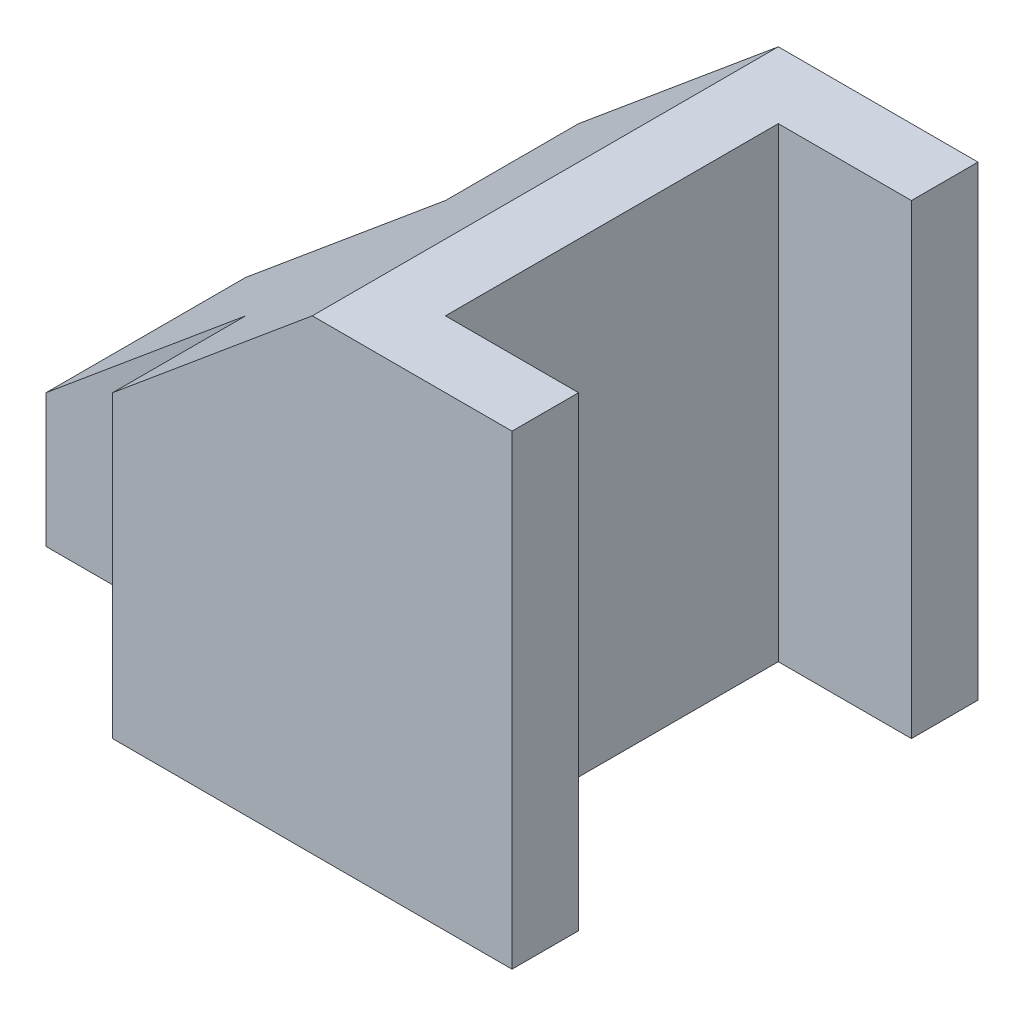
ISO-10303-21;
HEADER;
FILE_DESCRIPTION(('STEP AP214'),'2;1');
FILE_NAME('part.step','',(''),(''),'','','');
FILE_SCHEMA(('AUTOMOTIVE_DESIGN { 1 0 10303 214 1 1 1 1 }'));
ENDSEC;
DATA;
#1=APPLICATION_CONTEXT('core data for automotive mechanical design processes');
#2=APPLICATION_PROTOCOL_DEFINITION('international standard','automotive_design',2000,#1);
#3=PRODUCT_CONTEXT('',#1,'mechanical');
#4=PRODUCT('Part','Part','',(#3));
#5=PRODUCT_RELATED_PRODUCT_CATEGORY('part','',(#4));
#6=PRODUCT_DEFINITION_FORMATION('','',#4);
#7=PRODUCT_DEFINITION_CONTEXT('part definition',#1,'design');
#8=PRODUCT_DEFINITION('design','',#6,#7);
#9=PRODUCT_DEFINITION_SHAPE('','',#8);
#10=(LENGTH_UNIT() NAMED_UNIT(*) SI_UNIT(.MILLI.,.METRE.));
#11=(NAMED_UNIT(*) PLANE_ANGLE_UNIT() SI_UNIT($,.RADIAN.));
#12=(NAMED_UNIT(*) SI_UNIT($,.STERADIAN.) SOLID_ANGLE_UNIT());
#13=UNCERTAINTY_MEASURE_WITH_UNIT(LENGTH_MEASURE(1.E-05),#10,'distance_accuracy_value','');
#14=(GEOMETRIC_REPRESENTATION_CONTEXT(3) GLOBAL_UNCERTAINTY_ASSIGNED_CONTEXT((#13)) GLOBAL_UNIT_ASSIGNED_CONTEXT((#10,
#11,#12)) REPRESENTATION_CONTEXT('',''));
#15=CARTESIAN_POINT('',(0.,0.,0.));
#16=DIRECTION('',(0.,0.,1.));
#17=DIRECTION('',(1.,0.,0.));
#18=AXIS2_PLACEMENT_3D('',#15,#16,#17);
#19=CARTESIAN_POINT('',(0.,10000.,-35000.));
#20=DIRECTION('',(-1.,0.,0.));
#21=DIRECTION('',(0.,0.,1.));
#22=AXIS2_PLACEMENT_3D('',#19,#20,#21);
#23=PLANE('',#22);
#24=DIRECTION('',(0.,1.,0.));
#25=VECTOR('',#24,1.);
#26=CARTESIAN_POINT('',(0.,0.,-25000.));
#27=LINE('',#26,#25);
#28=CARTESIAN_POINT('',(0.,0.,-25000.));
#29=VERTEX_POINT('',#28);
#30=CARTESIAN_POINT('',(0.,10000.,-25000.));
#31=VERTEX_POINT('',#30);
#32=EDGE_CURVE('E127',#29,#31,#27,.T.);
#33=ORIENTED_EDGE('',*,*,#32,.F.);
#34=DIRECTION('',(0.,0.,1.));
#35=VECTOR('',#34,1.);
#36=CARTESIAN_POINT('',(0.,0.,-35000.));
#37=LINE('',#36,#35);
#38=CARTESIAN_POINT('',(0.,0.,-10000.));
#39=VERTEX_POINT('',#38);
#40=EDGE_CURVE('E35',#29,#39,#37,.T.);
#41=ORIENTED_EDGE('',*,*,#40,.T.);
#42=DIRECTION('',(0.,-1.,0.));
#43=VECTOR('',#42,1.);
#44=CARTESIAN_POINT('',(0.,10000.,-10000.));
#45=LINE('',#44,#43);
#46=CARTESIAN_POINT('',(0.,10000.,-10000.));
#47=VERTEX_POINT('',#46);
#48=EDGE_CURVE('E148',#47,#39,#45,.T.);
#49=ORIENTED_EDGE('',*,*,#48,.F.);
#50=DIRECTION('',(0.,0.,1.));
#51=VECTOR('',#50,1.);
#52=CARTESIAN_POINT('',(0.,10000.,-35000.));
#53=LINE('',#52,#51);
#54=EDGE_CURVE('E11',#31,#47,#53,.T.);
#55=ORIENTED_EDGE('',*,*,#54,.F.);
#56=EDGE_LOOP('',(#33,#41,#49,#55));
#57=FACE_BOUND('',#56,.T.);
#58=ADVANCED_FACE('F32',(#57),#23,.T.);
#59=CARTESIAN_POINT('',(45000.,0.,-35000.));
#60=DIRECTION('',(1.,0.,0.));
#61=DIRECTION('',(0.,0.,-1.));
#62=AXIS2_PLACEMENT_3D('',#59,#60,#61);
#63=PLANE('',#62);
#64=DIRECTION('',(0.,1.,0.));
#65=VECTOR('',#64,1.);
#66=CARTESIAN_POINT('',(45000.,0.,-5000.));
#67=LINE('',#66,#65);
#68=CARTESIAN_POINT('',(45000.,0.,-5000.));
#69=VERTEX_POINT('',#68);
#70=CARTESIAN_POINT('',(45000.,35000.,-5000.));
#71=VERTEX_POINT('',#70);
#72=EDGE_CURVE('E188',#69,#71,#67,.T.);
#73=ORIENTED_EDGE('',*,*,#72,.T.);
#74=DIRECTION('',(0.,0.,1.));
#75=VECTOR('',#74,1.);
#76=CARTESIAN_POINT('',(45000.,35000.,-35000.));
#77=LINE('',#76,#75);
#78=CARTESIAN_POINT('',(45000.,35000.,0.));
#79=VERTEX_POINT('',#78);
#80=EDGE_CURVE('E220',#71,#79,#77,.T.);
#81=ORIENTED_EDGE('',*,*,#80,.T.);
#82=DIRECTION('',(0.,1.,0.));
#83=VECTOR('',#82,1.);
#84=CARTESIAN_POINT('',(45000.,0.,0.));
#85=LINE('',#84,#83);
#86=CARTESIAN_POINT('',(45000.,0.,0.));
#87=VERTEX_POINT('',#86);
#88=EDGE_CURVE('E209',#87,#79,#85,.T.);
#89=ORIENTED_EDGE('',*,*,#88,.F.);
#90=DIRECTION('',(0.,0.,1.));
#91=VECTOR('',#90,1.);
#92=CARTESIAN_POINT('',(45000.,0.,-35000.));
#93=LINE('',#92,#91);
#94=EDGE_CURVE('E223',#69,#87,#93,.T.);
#95=ORIENTED_EDGE('',*,*,#94,.F.);
#96=EDGE_LOOP('',(#73,#81,#89,#95));
#97=FACE_BOUND('',#96,.T.);
#98=ADVANCED_FACE('F234',(#97),#63,.T.);
#99=CARTESIAN_POINT('',(30000.,35000.,-35000.));
#100=DIRECTION('',(-0.64018439966448,0.768221279597376,0.));
#101=DIRECTION('',(-0.768221279597376,-0.64018439966448,0.));
#102=AXIS2_PLACEMENT_3D('',#99,#100,#101);
#103=PLANE('',#102);
#104=DIRECTION('',(0.,0.,-1.));
#105=VECTOR('',#104,1.);
#106=CARTESIAN_POINT('',(15000.,22500.,-25000.));
#107=LINE('',#106,#105);
#108=CARTESIAN_POINT('',(15000.,22500.,-25000.));
#109=VERTEX_POINT('',#108);
#110=CARTESIAN_POINT('',(15000.,22500.,-35000.));
#111=VERTEX_POINT('',#110);
#112=EDGE_CURVE('E48',#109,#111,#107,.T.);
#113=ORIENTED_EDGE('',*,*,#112,.F.);
#114=DIRECTION('',(0.768221279597376,0.64018439966448,0.));
#115=VECTOR('',#114,1.);
#116=CARTESIAN_POINT('',(0.,10000.,-25000.));
#117=LINE('',#116,#115);
#118=EDGE_CURVE('E131',#31,#109,#117,.T.);
#119=ORIENTED_EDGE('',*,*,#118,.F.);
#120=ORIENTED_EDGE('',*,*,#54,.T.);
#121=DIRECTION('',(-0.768221279597376,-0.64018439966448,0.));
#122=VECTOR('',#121,1.);
#123=CARTESIAN_POINT('',(15000.,22500.,-10000.));
#124=LINE('',#123,#122);
#125=CARTESIAN_POINT('',(15000.,22500.,-10000.));
#126=VERTEX_POINT('',#125);
#127=EDGE_CURVE('E164',#126,#47,#124,.T.);
#128=ORIENTED_EDGE('',*,*,#127,.F.);
#129=DIRECTION('',(0.,0.,1.));
#130=VECTOR('',#129,1.);
#131=CARTESIAN_POINT('',(15000.,22500.,-10000.));
#132=LINE('',#131,#130);
#133=CARTESIAN_POINT('',(15000.,22500.,0.));
#134=VERTEX_POINT('',#133);
#135=EDGE_CURVE('E166',#126,#134,#132,.T.);
#136=ORIENTED_EDGE('',*,*,#135,.T.);
#137=DIRECTION('',(-0.768221279597376,-0.64018439966448,0.));
#138=VECTOR('',#137,1.);
#139=CARTESIAN_POINT('',(30000.,35000.,0.));
#140=LINE('',#139,#138);
#141=CARTESIAN_POINT('',(30000.,35000.,0.));
#142=VERTEX_POINT('',#141);
#143=EDGE_CURVE('E200',#142,#134,#140,.T.);
#144=ORIENTED_EDGE('',*,*,#143,.F.);
#145=DIRECTION('',(0.,0.,1.));
#146=VECTOR('',#145,1.);
#147=CARTESIAN_POINT('',(30000.,35000.,-35000.));
#148=LINE('',#147,#146);
#149=CARTESIAN_POINT('',(30000.,35000.,-35000.));
#150=VERTEX_POINT('',#149);
#151=EDGE_CURVE('E40',#150,#142,#148,.T.);
#152=ORIENTED_EDGE('',*,*,#151,.F.);
#153=DIRECTION('',(-0.768221279597376,-0.64018439966448,0.));
#154=VECTOR('',#153,1.);
#155=CARTESIAN_POINT('',(30000.,35000.,-35000.));
#156=LINE('',#155,#154);
#157=EDGE_CURVE('E206',#150,#111,#156,.T.);
#158=ORIENTED_EDGE('',*,*,#157,.T.);
#159=EDGE_LOOP('',(#113,#119,#120,#128,#136,#144,#152,#158));
#160=FACE_BOUND('',#159,.T.);
#161=ADVANCED_FACE('F140',(#160),#103,.T.);
#162=CARTESIAN_POINT('',(45000.,35000.,-35000.));
#163=DIRECTION('',(0.,1.,0.));
#164=DIRECTION('',(0.,0.,1.));
#165=AXIS2_PLACEMENT_3D('',#162,#163,#164);
#166=PLANE('',#165);
#167=DIRECTION('',(1.,0.,0.));
#168=VECTOR('',#167,1.);
#169=CARTESIAN_POINT('',(45000.,35000.,-5000.));
#170=LINE('',#169,#168);
#171=CARTESIAN_POINT('',(35000.,35000.,-5000.));
#172=VERTEX_POINT('',#171);
#173=EDGE_CURVE('E175',#172,#71,#170,.T.);
#174=ORIENTED_EDGE('',*,*,#173,.F.);
#175=DIRECTION('',(0.,0.,1.));
#176=VECTOR('',#175,1.);
#177=CARTESIAN_POINT('',(35000.,35000.,-30000.));
#178=LINE('',#177,#176);
#179=CARTESIAN_POINT('',(35000.,35000.,-30000.));
#180=VERTEX_POINT('',#179);
#181=EDGE_CURVE('E184',#180,#172,#178,.T.);
#182=ORIENTED_EDGE('',*,*,#181,.F.);
#183=DIRECTION('',(-1.,0.,0.));
#184=VECTOR('',#183,1.);
#185=CARTESIAN_POINT('',(45000.,35000.,-30000.));
#186=LINE('',#185,#184);
#187=CARTESIAN_POINT('',(45000.,35000.,-30000.));
#188=VERTEX_POINT('',#187);
#189=EDGE_CURVE('E169',#188,#180,#186,.T.);
#190=ORIENTED_EDGE('',*,*,#189,.F.);
#191=CARTESIAN_POINT('',(45000.,35000.,-35000.));
#192=VERTEX_POINT('',#191);
#193=EDGE_CURVE('E218',#192,#188,#77,.T.);
#194=ORIENTED_EDGE('',*,*,#193,.F.);
#195=DIRECTION('',(-1.,0.,0.));
#196=VECTOR('',#195,1.);
#197=CARTESIAN_POINT('',(45000.,35000.,-35000.));
#198=LINE('',#197,#196);
#199=EDGE_CURVE('E203',#192,#150,#198,.T.);
#200=ORIENTED_EDGE('',*,*,#199,.T.);
#201=ORIENTED_EDGE('',*,*,#151,.T.);
#202=DIRECTION('',(-1.,0.,0.));
#203=VECTOR('',#202,1.);
#204=CARTESIAN_POINT('',(45000.,35000.,0.));
#205=LINE('',#204,#203);
#206=EDGE_CURVE('E212',#79,#142,#205,.T.);
#207=ORIENTED_EDGE('',*,*,#206,.F.);
#208=ORIENTED_EDGE('',*,*,#80,.F.);
#209=EDGE_LOOP('',(#174,#182,#190,#194,#200,#201,#207,#208));
#210=FACE_BOUND('',#209,.T.);
#211=ADVANCED_FACE('F254',(#210),#166,.T.);
#212=DIRECTION('',(0.,1.,0.));
#213=VECTOR('',#212,1.);
#214=CARTESIAN_POINT('',(45000.,0.,-30000.));
#215=LINE('',#214,#213);
#216=CARTESIAN_POINT('',(45000.,0.,-30000.));
#217=VERTEX_POINT('',#216);
#218=EDGE_CURVE('E181',#217,#188,#215,.T.);
#219=ORIENTED_EDGE('',*,*,#218,.F.);
#220=CARTESIAN_POINT('',(45000.,0.,-35000.));
#221=VERTEX_POINT('',#220);
#222=EDGE_CURVE('E221',#221,#217,#93,.T.);
#223=ORIENTED_EDGE('',*,*,#222,.F.);
#224=DIRECTION('',(0.,1.,0.));
#225=VECTOR('',#224,1.);
#226=CARTESIAN_POINT('',(45000.,0.,-35000.));
#227=LINE('',#226,#225);
#228=EDGE_CURVE('E199',#221,#192,#227,.T.);
#229=ORIENTED_EDGE('',*,*,#228,.T.);
#230=ORIENTED_EDGE('',*,*,#193,.T.);
#231=EDGE_LOOP('',(#219,#223,#229,#230));
#232=FACE_BOUND('',#231,.T.);
#233=ADVANCED_FACE('F258',(#232),#63,.T.);
#234=CARTESIAN_POINT('',(0.,0.,-35000.));
#235=DIRECTION('',(0.,-1.,0.));
#236=DIRECTION('',(0.,0.,-1.));
#237=AXIS2_PLACEMENT_3D('',#234,#235,#236);
#238=PLANE('',#237);
#239=DIRECTION('',(0.,0.,-1.));
#240=VECTOR('',#239,1.);
#241=CARTESIAN_POINT('',(15000.,0.,-25000.));
#242=LINE('',#241,#240);
#243=CARTESIAN_POINT('',(15000.,0.,-25000.));
#244=VERTEX_POINT('',#243);
#245=CARTESIAN_POINT('',(15000.,0.,-35000.));
#246=VERTEX_POINT('',#245);
#247=EDGE_CURVE('E157',#244,#246,#242,.T.);
#248=ORIENTED_EDGE('',*,*,#247,.T.);
#249=DIRECTION('',(1.,0.,0.));
#250=VECTOR('',#249,1.);
#251=CARTESIAN_POINT('',(0.,0.,-35000.));
#252=LINE('',#251,#250);
#253=EDGE_CURVE('E197',#246,#221,#252,.T.);
#254=ORIENTED_EDGE('',*,*,#253,.T.);
#255=ORIENTED_EDGE('',*,*,#222,.T.);
#256=DIRECTION('',(-1.,0.,0.));
#257=VECTOR('',#256,1.);
#258=CARTESIAN_POINT('',(45000.,0.,-30000.));
#259=LINE('',#258,#257);
#260=CARTESIAN_POINT('',(35000.,0.,-30000.));
#261=VERTEX_POINT('',#260);
#262=EDGE_CURVE('E171',#217,#261,#259,.T.);
#263=ORIENTED_EDGE('',*,*,#262,.T.);
#264=DIRECTION('',(0.,0.,1.));
#265=VECTOR('',#264,1.);
#266=CARTESIAN_POINT('',(35000.,0.,-30000.));
#267=LINE('',#266,#265);
#268=CARTESIAN_POINT('',(35000.,0.,-5000.));
#269=VERTEX_POINT('',#268);
#270=EDGE_CURVE('E174',#261,#269,#267,.T.);
#271=ORIENTED_EDGE('',*,*,#270,.T.);
#272=DIRECTION('',(1.,0.,0.));
#273=VECTOR('',#272,1.);
#274=CARTESIAN_POINT('',(45000.,0.,-5000.));
#275=LINE('',#274,#273);
#276=EDGE_CURVE('E178',#269,#69,#275,.T.);
#277=ORIENTED_EDGE('',*,*,#276,.T.);
#278=ORIENTED_EDGE('',*,*,#94,.T.);
#279=DIRECTION('',(1.,0.,0.));
#280=VECTOR('',#279,1.);
#281=CARTESIAN_POINT('',(0.,0.,0.));
#282=LINE('',#281,#280);
#283=CARTESIAN_POINT('',(15000.,0.,0.));
#284=VERTEX_POINT('',#283);
#285=EDGE_CURVE('E191',#284,#87,#282,.T.);
#286=ORIENTED_EDGE('',*,*,#285,.F.);
#287=DIRECTION('',(0.,0.,1.));
#288=VECTOR('',#287,1.);
#289=CARTESIAN_POINT('',(15000.,0.,-10000.));
#290=LINE('',#289,#288);
#291=CARTESIAN_POINT('',(15000.,0.,-10000.));
#292=VERTEX_POINT('',#291);
#293=EDGE_CURVE('E56',#292,#284,#290,.T.);
#294=ORIENTED_EDGE('',*,*,#293,.F.);
#295=DIRECTION('',(1.,0.,0.));
#296=VECTOR('',#295,1.);
#297=CARTESIAN_POINT('',(0.,0.,-10000.));
#298=LINE('',#297,#296);
#299=EDGE_CURVE('E152',#39,#292,#298,.T.);
#300=ORIENTED_EDGE('',*,*,#299,.F.);
#301=ORIENTED_EDGE('',*,*,#40,.F.);
#302=DIRECTION('',(-1.,0.,0.));
#303=VECTOR('',#302,1.);
#304=CARTESIAN_POINT('',(15000.,0.,-25000.));
#305=LINE('',#304,#303);
#306=EDGE_CURVE('E133',#244,#29,#305,.T.);
#307=ORIENTED_EDGE('',*,*,#306,.F.);
#308=EDGE_LOOP('',(#248,#254,#255,#263,#271,#277,#278,#286,#294,#300,#301,#307));
#309=FACE_BOUND('',#308,.T.);
#310=ADVANCED_FACE('F231',(#309),#238,.T.);
#311=CARTESIAN_POINT('',(0.,0.,-35000.));
#312=DIRECTION('',(0.,0.,1.));
#313=DIRECTION('',(1.,0.,0.));
#314=AXIS2_PLACEMENT_3D('',#311,#312,#313);
#315=PLANE('',#314);
#316=ORIENTED_EDGE('',*,*,#253,.F.);
#317=DIRECTION('',(0.,-1.,0.));
#318=VECTOR('',#317,1.);
#319=CARTESIAN_POINT('',(15000.,22500.,-35000.));
#320=LINE('',#319,#318);
#321=EDGE_CURVE('E137',#111,#246,#320,.T.);
#322=ORIENTED_EDGE('',*,*,#321,.F.);
#323=ORIENTED_EDGE('',*,*,#157,.F.);
#324=ORIENTED_EDGE('',*,*,#199,.F.);
#325=ORIENTED_EDGE('',*,*,#228,.F.);
#326=EDGE_LOOP('',(#316,#322,#323,#324,#325));
#327=FACE_BOUND('',#326,.T.);
#328=ADVANCED_FACE('F249',(#327),#315,.F.);
#329=CARTESIAN_POINT('',(0.,0.,0.));
#330=DIRECTION('',(0.,0.,1.));
#331=DIRECTION('',(1.,0.,0.));
#332=AXIS2_PLACEMENT_3D('',#329,#330,#331);
#333=PLANE('',#332);
#334=DIRECTION('',(0.,1.,0.));
#335=VECTOR('',#334,1.);
#336=CARTESIAN_POINT('',(15000.,0.,0.));
#337=LINE('',#336,#335);
#338=EDGE_CURVE('E153',#284,#134,#337,.T.);
#339=ORIENTED_EDGE('',*,*,#338,.F.);
#340=ORIENTED_EDGE('',*,*,#285,.T.);
#341=ORIENTED_EDGE('',*,*,#88,.T.);
#342=ORIENTED_EDGE('',*,*,#206,.T.);
#343=ORIENTED_EDGE('',*,*,#143,.T.);
#344=EDGE_LOOP('',(#339,#340,#341,#342,#343));
#345=FACE_BOUND('',#344,.T.);
#346=ADVANCED_FACE('F238',(#345),#333,.T.);
#347=CARTESIAN_POINT('',(45000.,0.,-5000.));
#348=DIRECTION('',(0.,0.,1.));
#349=DIRECTION('',(1.,0.,0.));
#350=AXIS2_PLACEMENT_3D('',#347,#348,#349);
#351=PLANE('',#350);
#352=ORIENTED_EDGE('',*,*,#173,.T.);
#353=ORIENTED_EDGE('',*,*,#72,.F.);
#354=ORIENTED_EDGE('',*,*,#276,.F.);
#355=DIRECTION('',(0.,1.,0.));
#356=VECTOR('',#355,1.);
#357=CARTESIAN_POINT('',(35000.,0.,-5000.));
#358=LINE('',#357,#356);
#359=EDGE_CURVE('E192',#269,#172,#358,.T.);
#360=ORIENTED_EDGE('',*,*,#359,.T.);
#361=EDGE_LOOP('',(#352,#353,#354,#360));
#362=FACE_BOUND('',#361,.T.);
#363=ADVANCED_FACE('F266',(#362),#351,.F.);
#364=CARTESIAN_POINT('',(35000.,0.,-30000.));
#365=DIRECTION('',(-1.,0.,0.));
#366=DIRECTION('',(0.,0.,1.));
#367=AXIS2_PLACEMENT_3D('',#364,#365,#366);
#368=PLANE('',#367);
#369=ORIENTED_EDGE('',*,*,#181,.T.);
#370=ORIENTED_EDGE('',*,*,#359,.F.);
#371=ORIENTED_EDGE('',*,*,#270,.F.);
#372=DIRECTION('',(0.,1.,0.));
#373=VECTOR('',#372,1.);
#374=CARTESIAN_POINT('',(35000.,0.,-30000.));
#375=LINE('',#374,#373);
#376=EDGE_CURVE('E194',#261,#180,#375,.T.);
#377=ORIENTED_EDGE('',*,*,#376,.T.);
#378=EDGE_LOOP('',(#369,#370,#371,#377));
#379=FACE_BOUND('',#378,.T.);
#380=ADVANCED_FACE('F264',(#379),#368,.F.);
#381=CARTESIAN_POINT('',(45000.,0.,-30000.));
#382=DIRECTION('',(0.,0.,-1.));
#383=DIRECTION('',(-1.,0.,0.));
#384=AXIS2_PLACEMENT_3D('',#381,#382,#383);
#385=PLANE('',#384);
#386=ORIENTED_EDGE('',*,*,#189,.T.);
#387=ORIENTED_EDGE('',*,*,#376,.F.);
#388=ORIENTED_EDGE('',*,*,#262,.F.);
#389=ORIENTED_EDGE('',*,*,#218,.T.);
#390=EDGE_LOOP('',(#386,#387,#388,#389));
#391=FACE_BOUND('',#390,.T.);
#392=ADVANCED_FACE('F260',(#391),#385,.F.);
#393=CARTESIAN_POINT('',(15000.,0.,-10000.));
#394=DIRECTION('',(1.,0.,0.));
#395=DIRECTION('',(0.,0.,-1.));
#396=AXIS2_PLACEMENT_3D('',#393,#394,#395);
#397=PLANE('',#396);
#398=ORIENTED_EDGE('',*,*,#338,.T.);
#399=ORIENTED_EDGE('',*,*,#135,.F.);
#400=DIRECTION('',(0.,1.,0.));
#401=VECTOR('',#400,1.);
#402=CARTESIAN_POINT('',(15000.,0.,-10000.));
#403=LINE('',#402,#401);
#404=EDGE_CURVE('E155',#292,#126,#403,.T.);
#405=ORIENTED_EDGE('',*,*,#404,.F.);
#406=ORIENTED_EDGE('',*,*,#293,.T.);
#407=EDGE_LOOP('',(#398,#399,#405,#406));
#408=FACE_BOUND('',#407,.T.);
#409=ADVANCED_FACE('F240',(#408),#397,.F.);
#410=CARTESIAN_POINT('',(0.,0.,-10000.));
#411=DIRECTION('',(0.,0.,1.));
#412=DIRECTION('',(1.,0.,0.));
#413=AXIS2_PLACEMENT_3D('',#410,#411,#412);
#414=PLANE('',#413);
#415=ORIENTED_EDGE('',*,*,#48,.T.);
#416=ORIENTED_EDGE('',*,*,#299,.T.);
#417=ORIENTED_EDGE('',*,*,#404,.T.);
#418=ORIENTED_EDGE('',*,*,#127,.T.);
#419=EDGE_LOOP('',(#415,#416,#417,#418));
#420=FACE_BOUND('',#419,.T.);
#421=ADVANCED_FACE('F241',(#420),#414,.T.);
#422=CARTESIAN_POINT('',(15000.,22500.,-25000.));
#423=DIRECTION('',(1.,0.,0.));
#424=DIRECTION('',(0.,1.,0.));
#425=AXIS2_PLACEMENT_3D('',#422,#423,#424);
#426=PLANE('',#425);
#427=ORIENTED_EDGE('',*,*,#321,.T.);
#428=ORIENTED_EDGE('',*,*,#247,.F.);
#429=DIRECTION('',(0.,-1.,0.));
#430=VECTOR('',#429,1.);
#431=CARTESIAN_POINT('',(15000.,22500.,-25000.));
#432=LINE('',#431,#430);
#433=EDGE_CURVE('E144',#109,#244,#432,.T.);
#434=ORIENTED_EDGE('',*,*,#433,.F.);
#435=ORIENTED_EDGE('',*,*,#112,.T.);
#436=EDGE_LOOP('',(#427,#428,#434,#435));
#437=FACE_BOUND('',#436,.T.);
#438=ADVANCED_FACE('F246',(#437),#426,.F.);
#439=CARTESIAN_POINT('',(0.,0.,-25000.));
#440=DIRECTION('',(0.,0.,1.));
#441=DIRECTION('',(1.,0.,0.));
#442=AXIS2_PLACEMENT_3D('',#439,#440,#441);
#443=PLANE('',#442);
#444=ORIENTED_EDGE('',*,*,#32,.T.);
#445=ORIENTED_EDGE('',*,*,#118,.T.);
#446=ORIENTED_EDGE('',*,*,#433,.T.);
#447=ORIENTED_EDGE('',*,*,#306,.T.);
#448=EDGE_LOOP('',(#444,#445,#446,#447));
#449=FACE_BOUND('',#448,.T.);
#450=ADVANCED_FACE('F129',(#449),#443,.F.);
#451=CLOSED_SHELL('',(#58,#98,#161,#211,#233,#310,#328,#346,#363,#380,#392,#409,#421,#438,#450));
#452=MANIFOLD_SOLID_BREP('B2',#451);
#453=ADVANCED_BREP_SHAPE_REPRESENTATION('',(#18,#452),#14);
#454=SHAPE_DEFINITION_REPRESENTATION(#9,#453);
ENDSEC;
END-ISO-10303-21;
